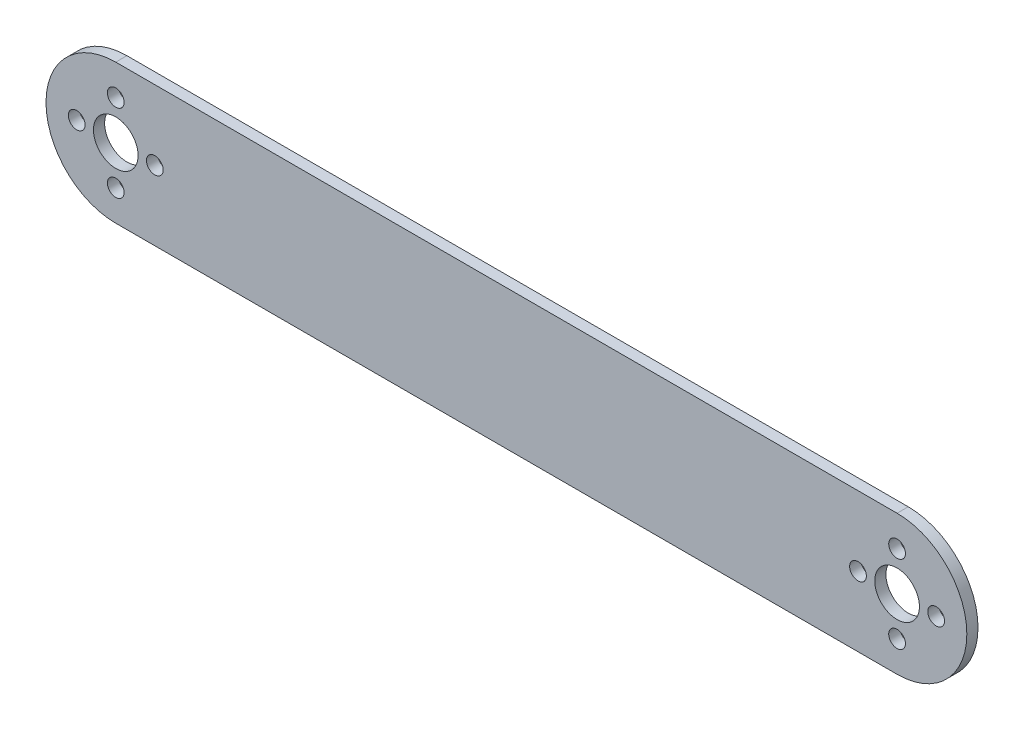
ISO-10303-21;
HEADER;
FILE_DESCRIPTION(('STEP AP214'),'2;1');
FILE_NAME('part.step','',(''),(''),'','','');
FILE_SCHEMA(('AUTOMOTIVE_DESIGN { 1 0 10303 214 1 1 1 1 }'));
ENDSEC;
DATA;
#1=APPLICATION_CONTEXT('core data for automotive mechanical design processes');
#2=APPLICATION_PROTOCOL_DEFINITION('international standard','automotive_design',2000,#1);
#3=PRODUCT_CONTEXT('',#1,'mechanical');
#4=PRODUCT('Part','Part','',(#3));
#5=PRODUCT_RELATED_PRODUCT_CATEGORY('part','',(#4));
#6=PRODUCT_DEFINITION_FORMATION('','',#4);
#7=PRODUCT_DEFINITION_CONTEXT('part definition',#1,'design');
#8=PRODUCT_DEFINITION('design','',#6,#7);
#9=PRODUCT_DEFINITION_SHAPE('','',#8);
#10=(LENGTH_UNIT() NAMED_UNIT(*) SI_UNIT(.MILLI.,.METRE.));
#11=(NAMED_UNIT(*) PLANE_ANGLE_UNIT() SI_UNIT($,.RADIAN.));
#12=(NAMED_UNIT(*) SI_UNIT($,.STERADIAN.) SOLID_ANGLE_UNIT());
#13=UNCERTAINTY_MEASURE_WITH_UNIT(LENGTH_MEASURE(1.E-05),#10,'distance_accuracy_value','');
#14=(GEOMETRIC_REPRESENTATION_CONTEXT(3) GLOBAL_UNCERTAINTY_ASSIGNED_CONTEXT((#13)) GLOBAL_UNIT_ASSIGNED_CONTEXT((#10,
#11,#12)) REPRESENTATION_CONTEXT('',''));
#15=CARTESIAN_POINT('',(0.,0.,0.));
#16=DIRECTION('',(0.,0.,1.));
#17=DIRECTION('',(1.,0.,0.));
#18=AXIS2_PLACEMENT_3D('',#15,#16,#17);
#19=CARTESIAN_POINT('',(15.,0.,2.));
#20=DIRECTION('',(0.,0.,1.));
#21=DIRECTION('',(1.,0.,0.));
#22=AXIS2_PLACEMENT_3D('',#19,#20,#21);
#23=PLANE('',#22);
#24=CARTESIAN_POINT('',(15.0000000000001,-6.99999999999998,2.));
#25=DIRECTION('',(0.,0.,1.));
#26=DIRECTION('',(1.,0.,0.));
#27=AXIS2_PLACEMENT_3D('',#24,#25,#26);
#28=CIRCLE('',#27,1.49999999999998);
#29=CARTESIAN_POINT('',(16.5000000000001,-6.99999999999998,2.));
#30=VERTEX_POINT('',#29);
#31=EDGE_CURVE('E160',#30,#30,#28,.T.);
#32=ORIENTED_EDGE('',*,*,#31,.F.);
#33=EDGE_LOOP('',(#32));
#34=FACE_BOUND('',#33,.T.);
#35=CARTESIAN_POINT('',(-132.,0.,2.));
#36=DIRECTION('',(0.,0.,1.));
#37=DIRECTION('',(1.,0.,0.));
#38=AXIS2_PLACEMENT_3D('',#35,#36,#37);
#39=CIRCLE('',#38,1.5);
#40=CARTESIAN_POINT('',(-130.5,0.,2.));
#41=VERTEX_POINT('',#40);
#42=EDGE_CURVE('E148',#41,#41,#39,.T.);
#43=ORIENTED_EDGE('',*,*,#42,.F.);
#44=EDGE_LOOP('',(#43));
#45=FACE_BOUND('',#44,.T.);
#46=CARTESIAN_POINT('',(-118.,0.,2.));
#47=DIRECTION('',(0.,0.,1.));
#48=DIRECTION('',(1.,0.,0.));
#49=AXIS2_PLACEMENT_3D('',#46,#47,#48);
#50=CIRCLE('',#49,1.5);
#51=CARTESIAN_POINT('',(-116.5,0.,2.));
#52=VERTEX_POINT('',#51);
#53=EDGE_CURVE('E136',#52,#52,#50,.T.);
#54=ORIENTED_EDGE('',*,*,#53,.F.);
#55=EDGE_LOOP('',(#54));
#56=FACE_BOUND('',#55,.T.);
#57=CARTESIAN_POINT('',(-125.,7.,2.));
#58=DIRECTION('',(0.,0.,1.));
#59=DIRECTION('',(1.,0.,0.));
#60=AXIS2_PLACEMENT_3D('',#57,#58,#59);
#61=CIRCLE('',#60,1.5);
#62=CARTESIAN_POINT('',(-123.5,7.,2.));
#63=VERTEX_POINT('',#62);
#64=EDGE_CURVE('E124',#63,#63,#61,.T.);
#65=ORIENTED_EDGE('',*,*,#64,.F.);
#66=EDGE_LOOP('',(#65));
#67=FACE_BOUND('',#66,.T.);
#68=CARTESIAN_POINT('',(15.,0.,2.));
#69=DIRECTION('',(0.,0.,1.));
#70=DIRECTION('',(1.,0.,0.));
#71=AXIS2_PLACEMENT_3D('',#68,#69,#70);
#72=CIRCLE('',#71,3.99999999999998);
#73=CARTESIAN_POINT('',(19.,0.,2.));
#74=VERTEX_POINT('',#73);
#75=EDGE_CURVE('E103',#74,#74,#72,.T.);
#76=ORIENTED_EDGE('',*,*,#75,.F.);
#77=EDGE_LOOP('',(#76));
#78=FACE_BOUND('',#77,.T.);
#79=CARTESIAN_POINT('',(15.,0.,2.));
#80=DIRECTION('',(0.,0.,1.));
#81=DIRECTION('',(1.,0.,0.));
#82=AXIS2_PLACEMENT_3D('',#79,#80,#81);
#83=CIRCLE('',#82,12.5);
#84=CARTESIAN_POINT('',(15.,-12.5,2.));
#85=VERTEX_POINT('',#84);
#86=CARTESIAN_POINT('',(15.,12.5,2.));
#87=VERTEX_POINT('',#86);
#88=EDGE_CURVE('E88',#85,#87,#83,.T.);
#89=ORIENTED_EDGE('',*,*,#88,.T.);
#90=DIRECTION('',(-1.,0.,0.));
#91=VECTOR('',#90,1.);
#92=CARTESIAN_POINT('',(-125.,12.5,2.));
#93=LINE('',#92,#91);
#94=CARTESIAN_POINT('',(-125.,12.5,2.));
#95=VERTEX_POINT('',#94);
#96=EDGE_CURVE('E83',#87,#95,#93,.T.);
#97=ORIENTED_EDGE('',*,*,#96,.T.);
#98=CARTESIAN_POINT('',(-125.,0.,2.));
#99=DIRECTION('',(0.,0.,1.));
#100=DIRECTION('',(-1.,0.,0.));
#101=AXIS2_PLACEMENT_3D('',#98,#99,#100);
#102=CIRCLE('',#101,12.5);
#103=CARTESIAN_POINT('',(-125.,-12.5,2.));
#104=VERTEX_POINT('',#103);
#105=EDGE_CURVE('E86',#95,#104,#102,.T.);
#106=ORIENTED_EDGE('',*,*,#105,.T.);
#107=DIRECTION('',(1.,0.,0.));
#108=VECTOR('',#107,1.);
#109=CARTESIAN_POINT('',(-125.,-12.5,2.));
#110=LINE('',#109,#108);
#111=EDGE_CURVE('E53',#104,#85,#110,.T.);
#112=ORIENTED_EDGE('',*,*,#111,.T.);
#113=EDGE_LOOP('',(#89,#97,#106,#112));
#114=FACE_BOUND('',#113,.T.);
#115=CARTESIAN_POINT('',(-125.,0.,2.));
#116=DIRECTION('',(0.,0.,1.));
#117=DIRECTION('',(1.,0.,0.));
#118=AXIS2_PLACEMENT_3D('',#115,#116,#117);
#119=CIRCLE('',#118,4.00000000000001);
#120=CARTESIAN_POINT('',(-121.,0.,2.));
#121=VERTEX_POINT('',#120);
#122=EDGE_CURVE('E118',#121,#121,#119,.T.);
#123=ORIENTED_EDGE('',*,*,#122,.F.);
#124=EDGE_LOOP('',(#123));
#125=FACE_BOUND('',#124,.T.);
#126=CARTESIAN_POINT('',(15.,7.00000000000002,2.));
#127=DIRECTION('',(0.,0.,1.));
#128=DIRECTION('',(1.,0.,0.));
#129=AXIS2_PLACEMENT_3D('',#126,#127,#128);
#130=CIRCLE('',#129,1.49999999999998);
#131=CARTESIAN_POINT('',(16.5,7.00000000000002,2.));
#132=VERTEX_POINT('',#131);
#133=EDGE_CURVE('E130',#132,#132,#130,.T.);
#134=ORIENTED_EDGE('',*,*,#133,.F.);
#135=EDGE_LOOP('',(#134));
#136=FACE_BOUND('',#135,.T.);
#137=CARTESIAN_POINT('',(-125.,-7.,2.));
#138=DIRECTION('',(0.,0.,1.));
#139=DIRECTION('',(1.,0.,0.));
#140=AXIS2_PLACEMENT_3D('',#137,#138,#139);
#141=CIRCLE('',#140,1.49999999999999);
#142=CARTESIAN_POINT('',(-123.5,-7.,2.));
#143=VERTEX_POINT('',#142);
#144=EDGE_CURVE('E142',#143,#143,#141,.T.);
#145=ORIENTED_EDGE('',*,*,#144,.F.);
#146=EDGE_LOOP('',(#145));
#147=FACE_BOUND('',#146,.T.);
#148=CARTESIAN_POINT('',(22.0000000000001,0.,2.));
#149=DIRECTION('',(0.,0.,1.));
#150=DIRECTION('',(1.,0.,0.));
#151=AXIS2_PLACEMENT_3D('',#148,#149,#150);
#152=CIRCLE('',#151,1.49999999999998);
#153=CARTESIAN_POINT('',(23.5000000000001,0.,2.));
#154=VERTEX_POINT('',#153);
#155=EDGE_CURVE('E154',#154,#154,#152,.T.);
#156=ORIENTED_EDGE('',*,*,#155,.F.);
#157=EDGE_LOOP('',(#156));
#158=FACE_BOUND('',#157,.T.);
#159=CARTESIAN_POINT('',(8.00000000000008,0.,2.));
#160=DIRECTION('',(0.,0.,1.));
#161=DIRECTION('',(1.,0.,0.));
#162=AXIS2_PLACEMENT_3D('',#159,#160,#161);
#163=CIRCLE('',#162,1.49999999999998);
#164=CARTESIAN_POINT('',(9.50000000000006,0.,2.));
#165=VERTEX_POINT('',#164);
#166=EDGE_CURVE('E166',#165,#165,#163,.T.);
#167=ORIENTED_EDGE('',*,*,#166,.F.);
#168=EDGE_LOOP('',(#167));
#169=FACE_BOUND('',#168,.T.);
#170=ADVANCED_FACE('F36',(#34,#45,#56,#67,#78,#114,#125,#136,#147,#158,#169),#23,.T.);
#171=CARTESIAN_POINT('',(15.,0.,0.));
#172=DIRECTION('',(0.,0.,1.));
#173=DIRECTION('',(1.,0.,0.));
#174=AXIS2_PLACEMENT_3D('',#171,#172,#173);
#175=PLANE('',#174);
#176=CARTESIAN_POINT('',(15.,0.,0.));
#177=DIRECTION('',(0.,0.,1.));
#178=DIRECTION('',(1.,0.,0.));
#179=AXIS2_PLACEMENT_3D('',#176,#177,#178);
#180=CIRCLE('',#179,12.5);
#181=CARTESIAN_POINT('',(15.,-12.5,0.));
#182=VERTEX_POINT('',#181);
#183=CARTESIAN_POINT('',(15.,12.5,0.));
#184=VERTEX_POINT('',#183);
#185=EDGE_CURVE('E100',#182,#184,#180,.T.);
#186=ORIENTED_EDGE('',*,*,#185,.F.);
#187=DIRECTION('',(1.,0.,0.));
#188=VECTOR('',#187,1.);
#189=CARTESIAN_POINT('',(-125.,-12.5,0.));
#190=LINE('',#189,#188);
#191=CARTESIAN_POINT('',(-125.,-12.5,0.));
#192=VERTEX_POINT('',#191);
#193=EDGE_CURVE('E76',#192,#182,#190,.T.);
#194=ORIENTED_EDGE('',*,*,#193,.F.);
#195=CARTESIAN_POINT('',(-125.,0.,0.));
#196=DIRECTION('',(0.,0.,1.));
#197=DIRECTION('',(-1.,0.,0.));
#198=AXIS2_PLACEMENT_3D('',#195,#196,#197);
#199=CIRCLE('',#198,12.5);
#200=CARTESIAN_POINT('',(-125.,12.5,0.));
#201=VERTEX_POINT('',#200);
#202=EDGE_CURVE('E70',#201,#192,#199,.T.);
#203=ORIENTED_EDGE('',*,*,#202,.F.);
#204=DIRECTION('',(-1.,0.,0.));
#205=VECTOR('',#204,1.);
#206=CARTESIAN_POINT('',(-125.,12.5,0.));
#207=LINE('',#206,#205);
#208=EDGE_CURVE('E92',#184,#201,#207,.T.);
#209=ORIENTED_EDGE('',*,*,#208,.F.);
#210=EDGE_LOOP('',(#186,#194,#203,#209));
#211=FACE_BOUND('',#210,.T.);
#212=CARTESIAN_POINT('',(15.,0.,0.));
#213=DIRECTION('',(0.,0.,1.));
#214=DIRECTION('',(1.,0.,0.));
#215=AXIS2_PLACEMENT_3D('',#212,#213,#214);
#216=CIRCLE('',#215,3.99999999999998);
#217=CARTESIAN_POINT('',(19.,0.,0.));
#218=VERTEX_POINT('',#217);
#219=EDGE_CURVE('E115',#218,#218,#216,.T.);
#220=ORIENTED_EDGE('',*,*,#219,.T.);
#221=EDGE_LOOP('',(#220));
#222=FACE_BOUND('',#221,.T.);
#223=CARTESIAN_POINT('',(-125.,0.,0.));
#224=DIRECTION('',(0.,0.,1.));
#225=DIRECTION('',(1.,0.,0.));
#226=AXIS2_PLACEMENT_3D('',#223,#224,#225);
#227=CIRCLE('',#226,4.00000000000001);
#228=CARTESIAN_POINT('',(-121.,0.,0.));
#229=VERTEX_POINT('',#228);
#230=EDGE_CURVE('E121',#229,#229,#227,.T.);
#231=ORIENTED_EDGE('',*,*,#230,.T.);
#232=EDGE_LOOP('',(#231));
#233=FACE_BOUND('',#232,.T.);
#234=CARTESIAN_POINT('',(-125.,7.,0.));
#235=DIRECTION('',(0.,0.,1.));
#236=DIRECTION('',(1.,0.,0.));
#237=AXIS2_PLACEMENT_3D('',#234,#235,#236);
#238=CIRCLE('',#237,1.5);
#239=CARTESIAN_POINT('',(-123.5,7.,0.));
#240=VERTEX_POINT('',#239);
#241=EDGE_CURVE('E127',#240,#240,#238,.T.);
#242=ORIENTED_EDGE('',*,*,#241,.T.);
#243=EDGE_LOOP('',(#242));
#244=FACE_BOUND('',#243,.T.);
#245=CARTESIAN_POINT('',(15.,7.00000000000002,0.));
#246=DIRECTION('',(0.,0.,1.));
#247=DIRECTION('',(1.,0.,0.));
#248=AXIS2_PLACEMENT_3D('',#245,#246,#247);
#249=CIRCLE('',#248,1.49999999999998);
#250=CARTESIAN_POINT('',(16.5,7.00000000000002,0.));
#251=VERTEX_POINT('',#250);
#252=EDGE_CURVE('E133',#251,#251,#249,.T.);
#253=ORIENTED_EDGE('',*,*,#252,.T.);
#254=EDGE_LOOP('',(#253));
#255=FACE_BOUND('',#254,.T.);
#256=CARTESIAN_POINT('',(-118.,0.,0.));
#257=DIRECTION('',(0.,0.,1.));
#258=DIRECTION('',(1.,0.,0.));
#259=AXIS2_PLACEMENT_3D('',#256,#257,#258);
#260=CIRCLE('',#259,1.5);
#261=CARTESIAN_POINT('',(-116.5,0.,0.));
#262=VERTEX_POINT('',#261);
#263=EDGE_CURVE('E139',#262,#262,#260,.T.);
#264=ORIENTED_EDGE('',*,*,#263,.T.);
#265=EDGE_LOOP('',(#264));
#266=FACE_BOUND('',#265,.T.);
#267=CARTESIAN_POINT('',(-125.,-7.,0.));
#268=DIRECTION('',(0.,0.,1.));
#269=DIRECTION('',(1.,0.,0.));
#270=AXIS2_PLACEMENT_3D('',#267,#268,#269);
#271=CIRCLE('',#270,1.49999999999999);
#272=CARTESIAN_POINT('',(-123.5,-7.,0.));
#273=VERTEX_POINT('',#272);
#274=EDGE_CURVE('E145',#273,#273,#271,.T.);
#275=ORIENTED_EDGE('',*,*,#274,.T.);
#276=EDGE_LOOP('',(#275));
#277=FACE_BOUND('',#276,.T.);
#278=CARTESIAN_POINT('',(-132.,0.,0.));
#279=DIRECTION('',(0.,0.,1.));
#280=DIRECTION('',(1.,0.,0.));
#281=AXIS2_PLACEMENT_3D('',#278,#279,#280);
#282=CIRCLE('',#281,1.5);
#283=CARTESIAN_POINT('',(-130.5,0.,0.));
#284=VERTEX_POINT('',#283);
#285=EDGE_CURVE('E151',#284,#284,#282,.T.);
#286=ORIENTED_EDGE('',*,*,#285,.T.);
#287=EDGE_LOOP('',(#286));
#288=FACE_BOUND('',#287,.T.);
#289=CARTESIAN_POINT('',(22.0000000000001,0.,0.));
#290=DIRECTION('',(0.,0.,1.));
#291=DIRECTION('',(1.,0.,0.));
#292=AXIS2_PLACEMENT_3D('',#289,#290,#291);
#293=CIRCLE('',#292,1.49999999999998);
#294=CARTESIAN_POINT('',(23.5000000000001,0.,0.));
#295=VERTEX_POINT('',#294);
#296=EDGE_CURVE('E157',#295,#295,#293,.T.);
#297=ORIENTED_EDGE('',*,*,#296,.T.);
#298=EDGE_LOOP('',(#297));
#299=FACE_BOUND('',#298,.T.);
#300=CARTESIAN_POINT('',(15.0000000000001,-6.99999999999998,0.));
#301=DIRECTION('',(0.,0.,1.));
#302=DIRECTION('',(1.,0.,0.));
#303=AXIS2_PLACEMENT_3D('',#300,#301,#302);
#304=CIRCLE('',#303,1.49999999999998);
#305=CARTESIAN_POINT('',(16.5000000000001,-6.99999999999998,0.));
#306=VERTEX_POINT('',#305);
#307=EDGE_CURVE('E163',#306,#306,#304,.T.);
#308=ORIENTED_EDGE('',*,*,#307,.T.);
#309=EDGE_LOOP('',(#308));
#310=FACE_BOUND('',#309,.T.);
#311=CARTESIAN_POINT('',(8.00000000000008,0.,0.));
#312=DIRECTION('',(0.,0.,1.));
#313=DIRECTION('',(1.,0.,0.));
#314=AXIS2_PLACEMENT_3D('',#311,#312,#313);
#315=CIRCLE('',#314,1.49999999999998);
#316=CARTESIAN_POINT('',(9.50000000000006,0.,0.));
#317=VERTEX_POINT('',#316);
#318=EDGE_CURVE('E169',#317,#317,#315,.T.);
#319=ORIENTED_EDGE('',*,*,#318,.T.);
#320=EDGE_LOOP('',(#319));
#321=FACE_BOUND('',#320,.T.);
#322=ADVANCED_FACE('F111',(#211,#222,#233,#244,#255,#266,#277,#288,#299,#310,#321),#175,.F.);
#323=CARTESIAN_POINT('',(15.,0.,2.));
#324=DIRECTION('',(0.,0.,-1.));
#325=DIRECTION('',(-1.,0.,0.));
#326=AXIS2_PLACEMENT_3D('',#323,#324,#325);
#327=CYLINDRICAL_SURFACE('',#326,12.5);
#328=ORIENTED_EDGE('',*,*,#185,.T.);
#329=DIRECTION('',(0.,0.,-1.));
#330=VECTOR('',#329,1.);
#331=CARTESIAN_POINT('',(15.,12.5,2.));
#332=LINE('',#331,#330);
#333=EDGE_CURVE('E11',#87,#184,#332,.T.);
#334=ORIENTED_EDGE('',*,*,#333,.F.);
#335=ORIENTED_EDGE('',*,*,#88,.F.);
#336=DIRECTION('',(0.,0.,-1.));
#337=VECTOR('',#336,1.);
#338=CARTESIAN_POINT('',(15.,-12.5,2.));
#339=LINE('',#338,#337);
#340=EDGE_CURVE('E96',#85,#182,#339,.T.);
#341=ORIENTED_EDGE('',*,*,#340,.T.);
#342=EDGE_LOOP('',(#328,#334,#335,#341));
#343=FACE_BOUND('',#342,.T.);
#344=ADVANCED_FACE('F38',(#343),#327,.T.);
#345=CARTESIAN_POINT('',(-125.,12.5,2.));
#346=DIRECTION('',(0.,-1.,0.));
#347=DIRECTION('',(0.,0.,-1.));
#348=AXIS2_PLACEMENT_3D('',#345,#346,#347);
#349=PLANE('',#348);
#350=ORIENTED_EDGE('',*,*,#208,.T.);
#351=DIRECTION('',(0.,0.,-1.));
#352=VECTOR('',#351,1.);
#353=CARTESIAN_POINT('',(-125.,12.5,2.));
#354=LINE('',#353,#352);
#355=EDGE_CURVE('E45',#95,#201,#354,.T.);
#356=ORIENTED_EDGE('',*,*,#355,.F.);
#357=ORIENTED_EDGE('',*,*,#96,.F.);
#358=ORIENTED_EDGE('',*,*,#333,.T.);
#359=EDGE_LOOP('',(#350,#356,#357,#358));
#360=FACE_BOUND('',#359,.T.);
#361=ADVANCED_FACE('F91',(#360),#349,.F.);
#362=CARTESIAN_POINT('',(-125.,0.,2.));
#363=DIRECTION('',(0.,0.,-1.));
#364=DIRECTION('',(-1.,0.,0.));
#365=AXIS2_PLACEMENT_3D('',#362,#363,#364);
#366=CYLINDRICAL_SURFACE('',#365,12.5);
#367=ORIENTED_EDGE('',*,*,#202,.T.);
#368=DIRECTION('',(0.,0.,-1.));
#369=VECTOR('',#368,1.);
#370=CARTESIAN_POINT('',(-125.,-12.5,2.));
#371=LINE('',#370,#369);
#372=EDGE_CURVE('E93',#104,#192,#371,.T.);
#373=ORIENTED_EDGE('',*,*,#372,.F.);
#374=ORIENTED_EDGE('',*,*,#105,.F.);
#375=ORIENTED_EDGE('',*,*,#355,.T.);
#376=EDGE_LOOP('',(#367,#373,#374,#375));
#377=FACE_BOUND('',#376,.T.);
#378=ADVANCED_FACE('F94',(#377),#366,.T.);
#379=CARTESIAN_POINT('',(-125.,-12.5,2.));
#380=DIRECTION('',(0.,1.,0.));
#381=DIRECTION('',(0.,0.,1.));
#382=AXIS2_PLACEMENT_3D('',#379,#380,#381);
#383=PLANE('',#382);
#384=ORIENTED_EDGE('',*,*,#193,.T.);
#385=ORIENTED_EDGE('',*,*,#340,.F.);
#386=ORIENTED_EDGE('',*,*,#111,.F.);
#387=ORIENTED_EDGE('',*,*,#372,.T.);
#388=EDGE_LOOP('',(#384,#385,#386,#387));
#389=FACE_BOUND('',#388,.T.);
#390=ADVANCED_FACE('F108',(#389),#383,.F.);
#391=CARTESIAN_POINT('',(15.,0.,2.));
#392=DIRECTION('',(0.,0.,-1.));
#393=DIRECTION('',(-1.,0.,0.));
#394=AXIS2_PLACEMENT_3D('',#391,#392,#393);
#395=CYLINDRICAL_SURFACE('',#394,3.99999999999998);
#396=ORIENTED_EDGE('',*,*,#75,.T.);
#397=EDGE_LOOP('',(#396));
#398=FACE_BOUND('',#397,.T.);
#399=ORIENTED_EDGE('',*,*,#219,.F.);
#400=EDGE_LOOP('',(#399));
#401=FACE_BOUND('',#400,.T.);
#402=ADVANCED_FACE('F188',(#398,#401),#395,.F.);
#403=CARTESIAN_POINT('',(-125.,0.,2.));
#404=DIRECTION('',(0.,0.,-1.));
#405=DIRECTION('',(-1.,0.,0.));
#406=AXIS2_PLACEMENT_3D('',#403,#404,#405);
#407=CYLINDRICAL_SURFACE('',#406,4.00000000000001);
#408=ORIENTED_EDGE('',*,*,#122,.T.);
#409=EDGE_LOOP('',(#408));
#410=FACE_BOUND('',#409,.T.);
#411=ORIENTED_EDGE('',*,*,#230,.F.);
#412=EDGE_LOOP('',(#411));
#413=FACE_BOUND('',#412,.T.);
#414=ADVANCED_FACE('F234',(#410,#413),#407,.F.);
#415=CARTESIAN_POINT('',(-125.,7.,2.));
#416=DIRECTION('',(0.,0.,-1.));
#417=DIRECTION('',(-1.,0.,0.));
#418=AXIS2_PLACEMENT_3D('',#415,#416,#417);
#419=CYLINDRICAL_SURFACE('',#418,1.5);
#420=ORIENTED_EDGE('',*,*,#64,.T.);
#421=EDGE_LOOP('',(#420));
#422=FACE_BOUND('',#421,.T.);
#423=ORIENTED_EDGE('',*,*,#241,.F.);
#424=EDGE_LOOP('',(#423));
#425=FACE_BOUND('',#424,.T.);
#426=ADVANCED_FACE('F242',(#422,#425),#419,.F.);
#427=CARTESIAN_POINT('',(15.,7.00000000000002,2.));
#428=DIRECTION('',(0.,0.,-1.));
#429=DIRECTION('',(-1.,0.,0.));
#430=AXIS2_PLACEMENT_3D('',#427,#428,#429);
#431=CYLINDRICAL_SURFACE('',#430,1.49999999999998);
#432=ORIENTED_EDGE('',*,*,#133,.T.);
#433=EDGE_LOOP('',(#432));
#434=FACE_BOUND('',#433,.T.);
#435=ORIENTED_EDGE('',*,*,#252,.F.);
#436=EDGE_LOOP('',(#435));
#437=FACE_BOUND('',#436,.T.);
#438=ADVANCED_FACE('F250',(#434,#437),#431,.F.);
#439=CARTESIAN_POINT('',(-118.,0.,2.));
#440=DIRECTION('',(0.,0.,-1.));
#441=DIRECTION('',(-1.,0.,0.));
#442=AXIS2_PLACEMENT_3D('',#439,#440,#441);
#443=CYLINDRICAL_SURFACE('',#442,1.5);
#444=ORIENTED_EDGE('',*,*,#53,.T.);
#445=EDGE_LOOP('',(#444));
#446=FACE_BOUND('',#445,.T.);
#447=ORIENTED_EDGE('',*,*,#263,.F.);
#448=EDGE_LOOP('',(#447));
#449=FACE_BOUND('',#448,.T.);
#450=ADVANCED_FACE('F259',(#446,#449),#443,.F.);
#451=CARTESIAN_POINT('',(-125.,-7.,2.));
#452=DIRECTION('',(0.,0.,-1.));
#453=DIRECTION('',(-1.,0.,0.));
#454=AXIS2_PLACEMENT_3D('',#451,#452,#453);
#455=CYLINDRICAL_SURFACE('',#454,1.49999999999999);
#456=ORIENTED_EDGE('',*,*,#144,.T.);
#457=EDGE_LOOP('',(#456));
#458=FACE_BOUND('',#457,.T.);
#459=ORIENTED_EDGE('',*,*,#274,.F.);
#460=EDGE_LOOP('',(#459));
#461=FACE_BOUND('',#460,.T.);
#462=ADVANCED_FACE('F268',(#458,#461),#455,.F.);
#463=CARTESIAN_POINT('',(-132.,0.,2.));
#464=DIRECTION('',(0.,0.,-1.));
#465=DIRECTION('',(-1.,0.,0.));
#466=AXIS2_PLACEMENT_3D('',#463,#464,#465);
#467=CYLINDRICAL_SURFACE('',#466,1.5);
#468=ORIENTED_EDGE('',*,*,#42,.T.);
#469=EDGE_LOOP('',(#468));
#470=FACE_BOUND('',#469,.T.);
#471=ORIENTED_EDGE('',*,*,#285,.F.);
#472=EDGE_LOOP('',(#471));
#473=FACE_BOUND('',#472,.T.);
#474=ADVANCED_FACE('F277',(#470,#473),#467,.F.);
#475=CARTESIAN_POINT('',(22.0000000000001,0.,2.));
#476=DIRECTION('',(0.,0.,-1.));
#477=DIRECTION('',(-1.,0.,0.));
#478=AXIS2_PLACEMENT_3D('',#475,#476,#477);
#479=CYLINDRICAL_SURFACE('',#478,1.49999999999998);
#480=ORIENTED_EDGE('',*,*,#155,.T.);
#481=EDGE_LOOP('',(#480));
#482=FACE_BOUND('',#481,.T.);
#483=ORIENTED_EDGE('',*,*,#296,.F.);
#484=EDGE_LOOP('',(#483));
#485=FACE_BOUND('',#484,.T.);
#486=ADVANCED_FACE('F286',(#482,#485),#479,.F.);
#487=CARTESIAN_POINT('',(15.0000000000001,-6.99999999999998,2.));
#488=DIRECTION('',(0.,0.,-1.));
#489=DIRECTION('',(-1.,0.,0.));
#490=AXIS2_PLACEMENT_3D('',#487,#488,#489);
#491=CYLINDRICAL_SURFACE('',#490,1.49999999999998);
#492=ORIENTED_EDGE('',*,*,#31,.T.);
#493=EDGE_LOOP('',(#492));
#494=FACE_BOUND('',#493,.T.);
#495=ORIENTED_EDGE('',*,*,#307,.F.);
#496=EDGE_LOOP('',(#495));
#497=FACE_BOUND('',#496,.T.);
#498=ADVANCED_FACE('F295',(#494,#497),#491,.F.);
#499=CARTESIAN_POINT('',(8.00000000000008,0.,2.));
#500=DIRECTION('',(0.,0.,-1.));
#501=DIRECTION('',(-1.,0.,0.));
#502=AXIS2_PLACEMENT_3D('',#499,#500,#501);
#503=CYLINDRICAL_SURFACE('',#502,1.49999999999998);
#504=ORIENTED_EDGE('',*,*,#166,.T.);
#505=EDGE_LOOP('',(#504));
#506=FACE_BOUND('',#505,.T.);
#507=ORIENTED_EDGE('',*,*,#318,.F.);
#508=EDGE_LOOP('',(#507));
#509=FACE_BOUND('',#508,.T.);
#510=ADVANCED_FACE('F175',(#506,#509),#503,.F.);
#511=CLOSED_SHELL('',(#170,#322,#344,#361,#378,#390,#402,#414,#426,#438,#450,#462,#474,#486,
#498,#510));
#512=MANIFOLD_SOLID_BREP('B2',#511);
#513=ADVANCED_BREP_SHAPE_REPRESENTATION('',(#18,#512),#14);
#514=SHAPE_DEFINITION_REPRESENTATION(#9,#513);
ENDSEC;
END-ISO-10303-21;
